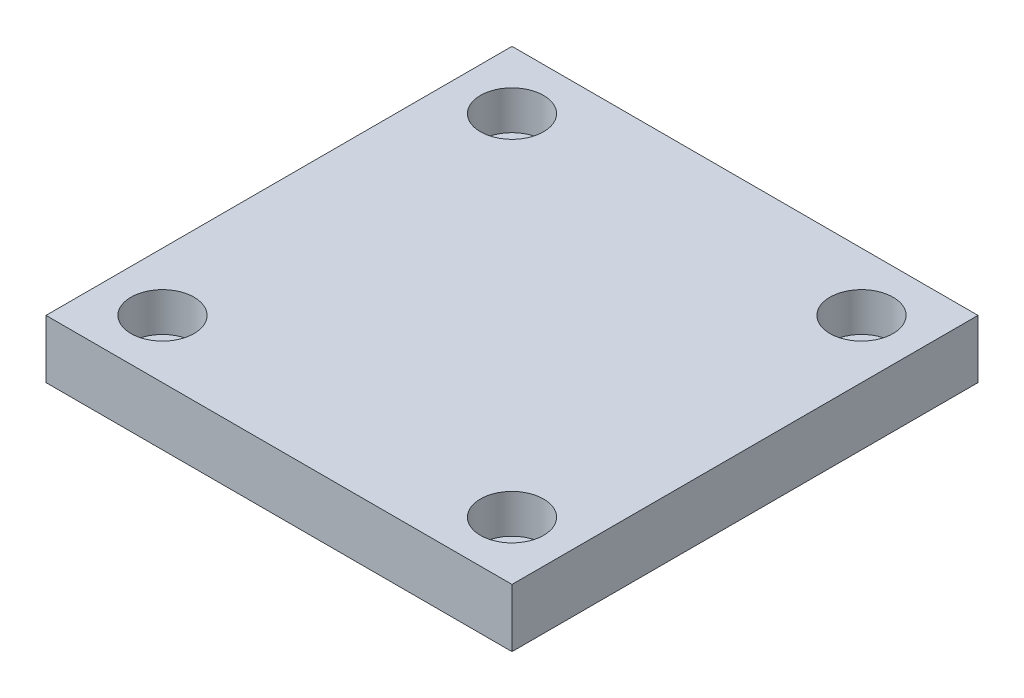
ISO-10303-21;
HEADER;
FILE_DESCRIPTION(('STEP AP214'),'2;1');
FILE_NAME('part.step','',(''),(''),'','','');
FILE_SCHEMA(('AUTOMOTIVE_DESIGN { 1 0 10303 214 1 1 1 1 }'));
ENDSEC;
DATA;
#1=APPLICATION_CONTEXT('core data for automotive mechanical design processes');
#2=APPLICATION_PROTOCOL_DEFINITION('international standard','automotive_design',2000,#1);
#3=PRODUCT_CONTEXT('',#1,'mechanical');
#4=PRODUCT('Part','Part','',(#3));
#5=PRODUCT_RELATED_PRODUCT_CATEGORY('part','',(#4));
#6=PRODUCT_DEFINITION_FORMATION('','',#4);
#7=PRODUCT_DEFINITION_CONTEXT('part definition',#1,'design');
#8=PRODUCT_DEFINITION('design','',#6,#7);
#9=PRODUCT_DEFINITION_SHAPE('','',#8);
#10=(LENGTH_UNIT() NAMED_UNIT(*) SI_UNIT(.MILLI.,.METRE.));
#11=(NAMED_UNIT(*) PLANE_ANGLE_UNIT() SI_UNIT($,.RADIAN.));
#12=(NAMED_UNIT(*) SI_UNIT($,.STERADIAN.) SOLID_ANGLE_UNIT());
#13=UNCERTAINTY_MEASURE_WITH_UNIT(LENGTH_MEASURE(1.E-05),#10,'distance_accuracy_value','');
#14=(GEOMETRIC_REPRESENTATION_CONTEXT(3) GLOBAL_UNCERTAINTY_ASSIGNED_CONTEXT((#13)) GLOBAL_UNIT_ASSIGNED_CONTEXT((#10,
#11,#12)) REPRESENTATION_CONTEXT('',''));
#15=CARTESIAN_POINT('',(0.,0.,0.));
#16=DIRECTION('',(0.,0.,1.));
#17=DIRECTION('',(1.,0.,0.));
#18=AXIS2_PLACEMENT_3D('',#15,#16,#17);
#19=CARTESIAN_POINT('',(76.2,19.05,0.));
#20=DIRECTION('',(-1.,0.,0.));
#21=DIRECTION('',(0.,0.,1.));
#22=AXIS2_PLACEMENT_3D('',#19,#20,#21);
#23=PLANE('',#22);
#24=DIRECTION('',(0.,0.,-1.));
#25=VECTOR('',#24,1.);
#26=CARTESIAN_POINT('',(76.2,0.,0.));
#27=LINE('',#26,#25);
#28=CARTESIAN_POINT('',(76.2,0.,76.2));
#29=VERTEX_POINT('',#28);
#30=CARTESIAN_POINT('',(76.2,0.,-76.2));
#31=VERTEX_POINT('',#30);
#32=EDGE_CURVE('E139',#29,#31,#27,.T.);
#33=ORIENTED_EDGE('',*,*,#32,.T.);
#34=DIRECTION('',(0.,-1.,0.));
#35=VECTOR('',#34,1.);
#36=CARTESIAN_POINT('',(76.2,19.05,-76.2));
#37=LINE('',#36,#35);
#38=CARTESIAN_POINT('',(76.2,19.05,-76.2));
#39=VERTEX_POINT('',#38);
#40=EDGE_CURVE('E11',#39,#31,#37,.T.);
#41=ORIENTED_EDGE('',*,*,#40,.F.);
#42=DIRECTION('',(0.,0.,-1.));
#43=VECTOR('',#42,1.);
#44=CARTESIAN_POINT('',(76.2,19.05,0.));
#45=LINE('',#44,#43);
#46=CARTESIAN_POINT('',(76.2,19.05,76.2));
#47=VERTEX_POINT('',#46);
#48=EDGE_CURVE('E46',#47,#39,#45,.T.);
#49=ORIENTED_EDGE('',*,*,#48,.F.);
#50=DIRECTION('',(0.,-1.,0.));
#51=VECTOR('',#50,1.);
#52=CARTESIAN_POINT('',(76.2,19.05,76.2));
#53=LINE('',#52,#51);
#54=EDGE_CURVE('E76',#47,#29,#53,.T.);
#55=ORIENTED_EDGE('',*,*,#54,.T.);
#56=EDGE_LOOP('',(#33,#41,#49,#55));
#57=FACE_BOUND('',#56,.T.);
#58=ADVANCED_FACE('F32',(#57),#23,.F.);
#59=CARTESIAN_POINT('',(0.,19.05,-76.2));
#60=DIRECTION('',(0.,0.,1.));
#61=DIRECTION('',(1.,0.,0.));
#62=AXIS2_PLACEMENT_3D('',#59,#60,#61);
#63=PLANE('',#62);
#64=DIRECTION('',(-1.,0.,0.));
#65=VECTOR('',#64,1.);
#66=CARTESIAN_POINT('',(0.,0.,-76.2));
#67=LINE('',#66,#65);
#68=CARTESIAN_POINT('',(-76.2,0.,-76.2));
#69=VERTEX_POINT('',#68);
#70=EDGE_CURVE('E141',#31,#69,#67,.T.);
#71=ORIENTED_EDGE('',*,*,#70,.T.);
#72=DIRECTION('',(0.,-1.,0.));
#73=VECTOR('',#72,1.);
#74=CARTESIAN_POINT('',(-76.2,19.05,-76.2));
#75=LINE('',#74,#73);
#76=CARTESIAN_POINT('',(-76.2,19.05,-76.2));
#77=VERTEX_POINT('',#76);
#78=EDGE_CURVE('E87',#77,#69,#75,.T.);
#79=ORIENTED_EDGE('',*,*,#78,.F.);
#80=DIRECTION('',(-1.,0.,0.));
#81=VECTOR('',#80,1.);
#82=CARTESIAN_POINT('',(0.,19.05,-76.2));
#83=LINE('',#82,#81);
#84=EDGE_CURVE('E40',#39,#77,#83,.T.);
#85=ORIENTED_EDGE('',*,*,#84,.F.);
#86=ORIENTED_EDGE('',*,*,#40,.T.);
#87=EDGE_LOOP('',(#71,#79,#85,#86));
#88=FACE_BOUND('',#87,.T.);
#89=ADVANCED_FACE('F145',(#88),#63,.F.);
#90=CARTESIAN_POINT('',(0.,19.05,0.));
#91=DIRECTION('',(0.,-1.,0.));
#92=DIRECTION('',(0.,0.,-1.));
#93=AXIS2_PLACEMENT_3D('',#90,#91,#92);
#94=PLANE('',#93);
#95=CARTESIAN_POINT('',(57.15,19.05,-57.15));
#96=DIRECTION('',(0.,1.,0.));
#97=DIRECTION('',(0.,0.,1.));
#98=AXIS2_PLACEMENT_3D('',#95,#96,#97);
#99=CIRCLE('',#98,10.31875);
#100=CARTESIAN_POINT('',(57.15,19.05,-46.83125));
#101=VERTEX_POINT('',#100);
#102=EDGE_CURVE('E127',#101,#101,#99,.T.);
#103=ORIENTED_EDGE('',*,*,#102,.F.);
#104=EDGE_LOOP('',(#103));
#105=FACE_BOUND('',#104,.T.);
#106=ORIENTED_EDGE('',*,*,#84,.T.);
#107=DIRECTION('',(0.,0.,-1.));
#108=VECTOR('',#107,1.);
#109=CARTESIAN_POINT('',(-76.2,19.05,0.));
#110=LINE('',#109,#108);
#111=CARTESIAN_POINT('',(-76.2,19.05,76.2));
#112=VERTEX_POINT('',#111);
#113=EDGE_CURVE('E80',#112,#77,#110,.T.);
#114=ORIENTED_EDGE('',*,*,#113,.F.);
#115=DIRECTION('',(-1.,0.,0.));
#116=VECTOR('',#115,1.);
#117=CARTESIAN_POINT('',(0.,19.05,76.2));
#118=LINE('',#117,#116);
#119=EDGE_CURVE('E68',#47,#112,#118,.T.);
#120=ORIENTED_EDGE('',*,*,#119,.F.);
#121=ORIENTED_EDGE('',*,*,#48,.T.);
#122=EDGE_LOOP('',(#106,#114,#120,#121));
#123=FACE_BOUND('',#122,.T.);
#124=CARTESIAN_POINT('',(57.15,19.05,57.15));
#125=DIRECTION('',(0.,-1.,0.));
#126=DIRECTION('',(0.,0.,-1.));
#127=AXIS2_PLACEMENT_3D('',#124,#125,#126);
#128=CIRCLE('',#127,10.31875);
#129=CARTESIAN_POINT('',(57.15,19.05,46.83125));
#130=VERTEX_POINT('',#129);
#131=EDGE_CURVE('E113',#130,#130,#128,.T.);
#132=ORIENTED_EDGE('',*,*,#131,.T.);
#133=EDGE_LOOP('',(#132));
#134=FACE_BOUND('',#133,.T.);
#135=CARTESIAN_POINT('',(-57.15,19.05,-57.15));
#136=DIRECTION('',(0.,-1.,0.));
#137=DIRECTION('',(0.,0.,1.));
#138=AXIS2_PLACEMENT_3D('',#135,#136,#137);
#139=CIRCLE('',#138,10.31875);
#140=CARTESIAN_POINT('',(-57.15,19.05,-46.83125));
#141=VERTEX_POINT('',#140);
#142=EDGE_CURVE('E92',#141,#141,#139,.T.);
#143=ORIENTED_EDGE('',*,*,#142,.T.);
#144=EDGE_LOOP('',(#143));
#145=FACE_BOUND('',#144,.T.);
#146=CARTESIAN_POINT('',(-57.15,19.05,57.15));
#147=DIRECTION('',(0.,1.,0.));
#148=DIRECTION('',(0.,0.,-1.));
#149=AXIS2_PLACEMENT_3D('',#146,#147,#148);
#150=CIRCLE('',#149,10.31875);
#151=CARTESIAN_POINT('',(-57.15,19.05,46.83125));
#152=VERTEX_POINT('',#151);
#153=EDGE_CURVE('E222',#152,#152,#150,.T.);
#154=ORIENTED_EDGE('',*,*,#153,.F.);
#155=EDGE_LOOP('',(#154));
#156=FACE_BOUND('',#155,.T.);
#157=ADVANCED_FACE('F81',(#105,#123,#134,#145,#156),#94,.F.);
#158=CARTESIAN_POINT('',(0.,0.,0.));
#159=DIRECTION('',(0.,-1.,0.));
#160=DIRECTION('',(0.,0.,-1.));
#161=AXIS2_PLACEMENT_3D('',#158,#159,#160);
#162=PLANE('',#161);
#163=CARTESIAN_POINT('',(57.15,0.,-57.15));
#164=DIRECTION('',(0.,1.,0.));
#165=DIRECTION('',(0.,0.,1.));
#166=AXIS2_PLACEMENT_3D('',#163,#164,#165);
#167=CIRCLE('',#166,6.74623999999999);
#168=CARTESIAN_POINT('',(57.15,0.,-50.40376));
#169=VERTEX_POINT('',#168);
#170=EDGE_CURVE('E136',#169,#169,#167,.T.);
#171=ORIENTED_EDGE('',*,*,#170,.T.);
#172=EDGE_LOOP('',(#171));
#173=FACE_BOUND('',#172,.T.);
#174=DIRECTION('',(-1.,0.,0.));
#175=VECTOR('',#174,1.);
#176=CARTESIAN_POINT('',(0.,0.,76.2));
#177=LINE('',#176,#175);
#178=CARTESIAN_POINT('',(-76.2,0.,76.2));
#179=VERTEX_POINT('',#178);
#180=EDGE_CURVE('E77',#29,#179,#177,.T.);
#181=ORIENTED_EDGE('',*,*,#180,.T.);
#182=DIRECTION('',(0.,0.,-1.));
#183=VECTOR('',#182,1.);
#184=CARTESIAN_POINT('',(-76.2,0.,0.));
#185=LINE('',#184,#183);
#186=EDGE_CURVE('E88',#179,#69,#185,.T.);
#187=ORIENTED_EDGE('',*,*,#186,.T.);
#188=ORIENTED_EDGE('',*,*,#70,.F.);
#189=ORIENTED_EDGE('',*,*,#32,.F.);
#190=EDGE_LOOP('',(#181,#187,#188,#189));
#191=FACE_BOUND('',#190,.T.);
#192=CARTESIAN_POINT('',(57.15,0.,57.15));
#193=DIRECTION('',(0.,-1.,0.));
#194=DIRECTION('',(0.,0.,-1.));
#195=AXIS2_PLACEMENT_3D('',#192,#193,#194);
#196=CIRCLE('',#195,6.74623999999999);
#197=CARTESIAN_POINT('',(57.15,0.,50.40376));
#198=VERTEX_POINT('',#197);
#199=EDGE_CURVE('E122',#198,#198,#196,.T.);
#200=ORIENTED_EDGE('',*,*,#199,.F.);
#201=EDGE_LOOP('',(#200));
#202=FACE_BOUND('',#201,.T.);
#203=CARTESIAN_POINT('',(-57.15,0.,-57.15));
#204=DIRECTION('',(0.,-1.,0.));
#205=DIRECTION('',(0.,0.,1.));
#206=AXIS2_PLACEMENT_3D('',#203,#204,#205);
#207=CIRCLE('',#206,6.74623999999999);
#208=CARTESIAN_POINT('',(-57.15,0.,-50.40376));
#209=VERTEX_POINT('',#208);
#210=EDGE_CURVE('E108',#209,#209,#207,.T.);
#211=ORIENTED_EDGE('',*,*,#210,.F.);
#212=EDGE_LOOP('',(#211));
#213=FACE_BOUND('',#212,.T.);
#214=CARTESIAN_POINT('',(-57.15,0.,57.15));
#215=DIRECTION('',(0.,1.,0.));
#216=DIRECTION('',(0.,0.,-1.));
#217=AXIS2_PLACEMENT_3D('',#214,#215,#216);
#218=CIRCLE('',#217,6.74623999999999);
#219=CARTESIAN_POINT('',(-57.15,0.,50.40376));
#220=VERTEX_POINT('',#219);
#221=EDGE_CURVE('E93',#220,#220,#218,.T.);
#222=ORIENTED_EDGE('',*,*,#221,.T.);
#223=EDGE_LOOP('',(#222));
#224=FACE_BOUND('',#223,.T.);
#225=ADVANCED_FACE('F147',(#173,#191,#202,#213,#224),#162,.T.);
#226=CARTESIAN_POINT('',(57.15,19.05,-57.15));
#227=DIRECTION('',(0.,1.,0.));
#228=DIRECTION('',(0.,0.,1.));
#229=AXIS2_PLACEMENT_3D('',#226,#227,#228);
#230=CYLINDRICAL_SURFACE('',#229,6.74623999999999);
#231=ORIENTED_EDGE('',*,*,#170,.F.);
#232=EDGE_LOOP('',(#231));
#233=FACE_BOUND('',#232,.T.);
#234=CARTESIAN_POINT('',(57.15,6.35,-57.15));
#235=DIRECTION('',(0.,1.,0.));
#236=DIRECTION('',(0.,0.,1.));
#237=AXIS2_PLACEMENT_3D('',#234,#235,#236);
#238=CIRCLE('',#237,6.74623999999999);
#239=CARTESIAN_POINT('',(57.15,6.35,-50.40376));
#240=VERTEX_POINT('',#239);
#241=EDGE_CURVE('E133',#240,#240,#238,.T.);
#242=ORIENTED_EDGE('',*,*,#241,.T.);
#243=EDGE_LOOP('',(#242));
#244=FACE_BOUND('',#243,.T.);
#245=ADVANCED_FACE('F161',(#233,#244),#230,.F.);
#246=CARTESIAN_POINT('',(63.89624,6.35,-57.15));
#247=DIRECTION('',(0.,-1.,0.));
#248=DIRECTION('',(0.,0.,-1.));
#249=AXIS2_PLACEMENT_3D('',#246,#247,#248);
#250=PLANE('',#249);
#251=ORIENTED_EDGE('',*,*,#241,.F.);
#252=EDGE_LOOP('',(#251));
#253=FACE_BOUND('',#252,.T.);
#254=CARTESIAN_POINT('',(57.15,6.35,-57.15));
#255=DIRECTION('',(0.,1.,0.));
#256=DIRECTION('',(0.,0.,1.));
#257=AXIS2_PLACEMENT_3D('',#254,#255,#256);
#258=CIRCLE('',#257,10.31875);
#259=CARTESIAN_POINT('',(57.15,6.35,-46.83125));
#260=VERTEX_POINT('',#259);
#261=EDGE_CURVE('E130',#260,#260,#258,.T.);
#262=ORIENTED_EDGE('',*,*,#261,.T.);
#263=EDGE_LOOP('',(#262));
#264=FACE_BOUND('',#263,.T.);
#265=ADVANCED_FACE('F166',(#253,#264),#250,.F.);
#266=CARTESIAN_POINT('',(57.15,19.05,-57.15));
#267=DIRECTION('',(0.,1.,0.));
#268=DIRECTION('',(0.,0.,1.));
#269=AXIS2_PLACEMENT_3D('',#266,#267,#268);
#270=CYLINDRICAL_SURFACE('',#269,10.31875);
#271=ORIENTED_EDGE('',*,*,#261,.F.);
#272=EDGE_LOOP('',(#271));
#273=FACE_BOUND('',#272,.T.);
#274=ORIENTED_EDGE('',*,*,#102,.T.);
#275=EDGE_LOOP('',(#274));
#276=FACE_BOUND('',#275,.T.);
#277=ADVANCED_FACE('F170',(#273,#276),#270,.F.);
#278=CARTESIAN_POINT('',(0.,19.05,76.2));
#279=DIRECTION('',(0.,0.,-1.));
#280=DIRECTION('',(1.,0.,0.));
#281=AXIS2_PLACEMENT_3D('',#278,#279,#280);
#282=PLANE('',#281);
#283=ORIENTED_EDGE('',*,*,#180,.F.);
#284=ORIENTED_EDGE('',*,*,#54,.F.);
#285=ORIENTED_EDGE('',*,*,#119,.T.);
#286=DIRECTION('',(0.,-1.,0.));
#287=VECTOR('',#286,1.);
#288=CARTESIAN_POINT('',(-76.2,19.05,76.2));
#289=LINE('',#288,#287);
#290=EDGE_CURVE('E73',#112,#179,#289,.T.);
#291=ORIENTED_EDGE('',*,*,#290,.T.);
#292=EDGE_LOOP('',(#283,#284,#285,#291));
#293=FACE_BOUND('',#292,.T.);
#294=ADVANCED_FACE('F71',(#293),#282,.F.);
#295=CARTESIAN_POINT('',(57.15,19.05,57.15));
#296=DIRECTION('',(0.,1.,0.));
#297=DIRECTION('',(0.,0.,-1.));
#298=AXIS2_PLACEMENT_3D('',#295,#296,#297);
#299=CYLINDRICAL_SURFACE('',#298,6.74623999999999);
#300=ORIENTED_EDGE('',*,*,#199,.T.);
#301=EDGE_LOOP('',(#300));
#302=FACE_BOUND('',#301,.T.);
#303=CARTESIAN_POINT('',(57.15,6.35,57.15));
#304=DIRECTION('',(0.,-1.,0.));
#305=DIRECTION('',(0.,0.,-1.));
#306=AXIS2_PLACEMENT_3D('',#303,#304,#305);
#307=CIRCLE('',#306,6.74623999999999);
#308=CARTESIAN_POINT('',(57.15,6.35,50.40376));
#309=VERTEX_POINT('',#308);
#310=EDGE_CURVE('E119',#309,#309,#307,.T.);
#311=ORIENTED_EDGE('',*,*,#310,.F.);
#312=EDGE_LOOP('',(#311));
#313=FACE_BOUND('',#312,.T.);
#314=ADVANCED_FACE('F177',(#302,#313),#299,.F.);
#315=CARTESIAN_POINT('',(63.89624,6.35,57.15));
#316=DIRECTION('',(0.,-1.,0.));
#317=DIRECTION('',(0.,0.,1.));
#318=AXIS2_PLACEMENT_3D('',#315,#316,#317);
#319=PLANE('',#318);
#320=ORIENTED_EDGE('',*,*,#310,.T.);
#321=EDGE_LOOP('',(#320));
#322=FACE_BOUND('',#321,.T.);
#323=CARTESIAN_POINT('',(57.15,6.35,57.15));
#324=DIRECTION('',(0.,-1.,0.));
#325=DIRECTION('',(0.,0.,-1.));
#326=AXIS2_PLACEMENT_3D('',#323,#324,#325);
#327=CIRCLE('',#326,10.31875);
#328=CARTESIAN_POINT('',(57.15,6.35,46.83125));
#329=VERTEX_POINT('',#328);
#330=EDGE_CURVE('E116',#329,#329,#327,.T.);
#331=ORIENTED_EDGE('',*,*,#330,.F.);
#332=EDGE_LOOP('',(#331));
#333=FACE_BOUND('',#332,.T.);
#334=ADVANCED_FACE('F180',(#322,#333),#319,.F.);
#335=CARTESIAN_POINT('',(57.15,19.05,57.15));
#336=DIRECTION('',(0.,1.,0.));
#337=DIRECTION('',(0.,0.,-1.));
#338=AXIS2_PLACEMENT_3D('',#335,#336,#337);
#339=CYLINDRICAL_SURFACE('',#338,10.31875);
#340=ORIENTED_EDGE('',*,*,#330,.T.);
#341=EDGE_LOOP('',(#340));
#342=FACE_BOUND('',#341,.T.);
#343=ORIENTED_EDGE('',*,*,#131,.F.);
#344=EDGE_LOOP('',(#343));
#345=FACE_BOUND('',#344,.T.);
#346=ADVANCED_FACE('F184',(#342,#345),#339,.F.);
#347=CARTESIAN_POINT('',(-76.2,19.05,0.));
#348=DIRECTION('',(1.,0.,0.));
#349=DIRECTION('',(0.,0.,1.));
#350=AXIS2_PLACEMENT_3D('',#347,#348,#349);
#351=PLANE('',#350);
#352=ORIENTED_EDGE('',*,*,#186,.F.);
#353=ORIENTED_EDGE('',*,*,#290,.F.);
#354=ORIENTED_EDGE('',*,*,#113,.T.);
#355=ORIENTED_EDGE('',*,*,#78,.T.);
#356=EDGE_LOOP('',(#352,#353,#354,#355));
#357=FACE_BOUND('',#356,.T.);
#358=ADVANCED_FACE('F90',(#357),#351,.F.);
#359=CARTESIAN_POINT('',(-57.15,19.05,-57.15));
#360=DIRECTION('',(0.,1.,0.));
#361=DIRECTION('',(0.,0.,1.));
#362=AXIS2_PLACEMENT_3D('',#359,#360,#361);
#363=CYLINDRICAL_SURFACE('',#362,6.74623999999999);
#364=ORIENTED_EDGE('',*,*,#210,.T.);
#365=EDGE_LOOP('',(#364));
#366=FACE_BOUND('',#365,.T.);
#367=CARTESIAN_POINT('',(-57.15,6.35,-57.15));
#368=DIRECTION('',(0.,-1.,0.));
#369=DIRECTION('',(0.,0.,1.));
#370=AXIS2_PLACEMENT_3D('',#367,#368,#369);
#371=CIRCLE('',#370,6.74623999999999);
#372=CARTESIAN_POINT('',(-57.15,6.35,-50.40376));
#373=VERTEX_POINT('',#372);
#374=EDGE_CURVE('E105',#373,#373,#371,.T.);
#375=ORIENTED_EDGE('',*,*,#374,.F.);
#376=EDGE_LOOP('',(#375));
#377=FACE_BOUND('',#376,.T.);
#378=ADVANCED_FACE('F191',(#366,#377),#363,.F.);
#379=CARTESIAN_POINT('',(-63.89624,6.35,-57.15));
#380=DIRECTION('',(0.,-1.,0.));
#381=DIRECTION('',(0.,0.,-1.));
#382=AXIS2_PLACEMENT_3D('',#379,#380,#381);
#383=PLANE('',#382);
#384=ORIENTED_EDGE('',*,*,#374,.T.);
#385=EDGE_LOOP('',(#384));
#386=FACE_BOUND('',#385,.T.);
#387=CARTESIAN_POINT('',(-57.15,6.35,-57.15));
#388=DIRECTION('',(0.,-1.,0.));
#389=DIRECTION('',(0.,0.,1.));
#390=AXIS2_PLACEMENT_3D('',#387,#388,#389);
#391=CIRCLE('',#390,10.31875);
#392=CARTESIAN_POINT('',(-57.15,6.35,-46.83125));
#393=VERTEX_POINT('',#392);
#394=EDGE_CURVE('E96',#393,#393,#391,.T.);
#395=ORIENTED_EDGE('',*,*,#394,.F.);
#396=EDGE_LOOP('',(#395));
#397=FACE_BOUND('',#396,.T.);
#398=ADVANCED_FACE('F194',(#386,#397),#383,.F.);
#399=CARTESIAN_POINT('',(-57.15,19.05,-57.15));
#400=DIRECTION('',(0.,1.,0.));
#401=DIRECTION('',(0.,0.,1.));
#402=AXIS2_PLACEMENT_3D('',#399,#400,#401);
#403=CYLINDRICAL_SURFACE('',#402,10.31875);
#404=ORIENTED_EDGE('',*,*,#394,.T.);
#405=EDGE_LOOP('',(#404));
#406=FACE_BOUND('',#405,.T.);
#407=ORIENTED_EDGE('',*,*,#142,.F.);
#408=EDGE_LOOP('',(#407));
#409=FACE_BOUND('',#408,.T.);
#410=ADVANCED_FACE('F198',(#406,#409),#403,.F.);
#411=CARTESIAN_POINT('',(-57.15,19.05,57.15));
#412=DIRECTION('',(0.,1.,0.));
#413=DIRECTION('',(0.,0.,-1.));
#414=AXIS2_PLACEMENT_3D('',#411,#412,#413);
#415=CYLINDRICAL_SURFACE('',#414,6.74623999999999);
#416=ORIENTED_EDGE('',*,*,#221,.F.);
#417=EDGE_LOOP('',(#416));
#418=FACE_BOUND('',#417,.T.);
#419=CARTESIAN_POINT('',(-57.15,6.35,57.15));
#420=DIRECTION('',(0.,1.,0.));
#421=DIRECTION('',(0.,0.,-1.));
#422=AXIS2_PLACEMENT_3D('',#419,#420,#421);
#423=CIRCLE('',#422,6.74623999999999);
#424=CARTESIAN_POINT('',(-57.15,6.35,50.40376));
#425=VERTEX_POINT('',#424);
#426=EDGE_CURVE('E99',#425,#425,#423,.T.);
#427=ORIENTED_EDGE('',*,*,#426,.T.);
#428=EDGE_LOOP('',(#427));
#429=FACE_BOUND('',#428,.T.);
#430=ADVANCED_FACE('F202',(#418,#429),#415,.F.);
#431=CARTESIAN_POINT('',(-63.89624,6.35,57.15));
#432=DIRECTION('',(0.,-1.,0.));
#433=DIRECTION('',(0.,0.,1.));
#434=AXIS2_PLACEMENT_3D('',#431,#432,#433);
#435=PLANE('',#434);
#436=ORIENTED_EDGE('',*,*,#426,.F.);
#437=EDGE_LOOP('',(#436));
#438=FACE_BOUND('',#437,.T.);
#439=CARTESIAN_POINT('',(-57.15,6.35,57.15));
#440=DIRECTION('',(0.,1.,0.));
#441=DIRECTION('',(0.,0.,-1.));
#442=AXIS2_PLACEMENT_3D('',#439,#440,#441);
#443=CIRCLE('',#442,10.31875);
#444=CARTESIAN_POINT('',(-57.15,6.35,46.83125));
#445=VERTEX_POINT('',#444);
#446=EDGE_CURVE('E219',#445,#445,#443,.T.);
#447=ORIENTED_EDGE('',*,*,#446,.T.);
#448=EDGE_LOOP('',(#447));
#449=FACE_BOUND('',#448,.T.);
#450=ADVANCED_FACE('F206',(#438,#449),#435,.F.);
#451=CARTESIAN_POINT('',(-57.15,19.05,57.15));
#452=DIRECTION('',(0.,1.,0.));
#453=DIRECTION('',(0.,0.,-1.));
#454=AXIS2_PLACEMENT_3D('',#451,#452,#453);
#455=CYLINDRICAL_SURFACE('',#454,10.31875);
#456=ORIENTED_EDGE('',*,*,#446,.F.);
#457=EDGE_LOOP('',(#456));
#458=FACE_BOUND('',#457,.T.);
#459=ORIENTED_EDGE('',*,*,#153,.T.);
#460=EDGE_LOOP('',(#459));
#461=FACE_BOUND('',#460,.T.);
#462=ADVANCED_FACE('F210',(#458,#461),#455,.F.);
#463=CLOSED_SHELL('',(#58,#89,#157,#225,#245,#265,#277,#294,#314,#334,#346,#358,#378,#398,#410,
#430,#450,#462));
#464=MANIFOLD_SOLID_BREP('B2',#463);
#465=ADVANCED_BREP_SHAPE_REPRESENTATION('',(#18,#464),#14);
#466=SHAPE_DEFINITION_REPRESENTATION(#9,#465);
ENDSEC;
END-ISO-10303-21;
